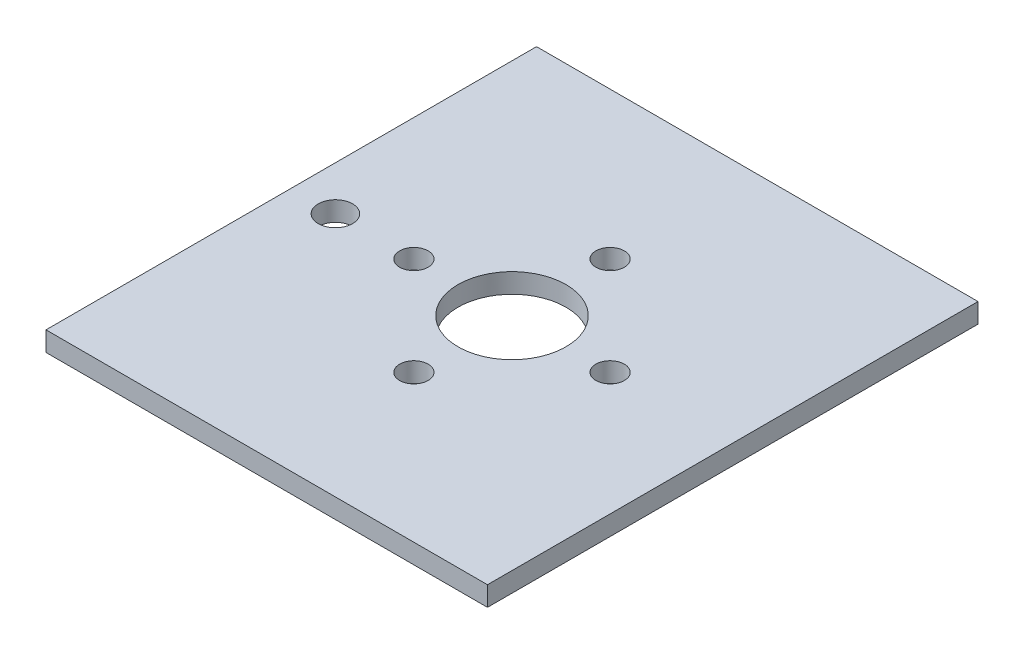
ISO-10303-21;
HEADER;
FILE_DESCRIPTION(('STEP AP214'),'2;1');
FILE_NAME('part.step','',(''),(''),'','','');
FILE_SCHEMA(('AUTOMOTIVE_DESIGN { 1 0 10303 214 1 1 1 1 }'));
ENDSEC;
DATA;
#1=APPLICATION_CONTEXT('core data for automotive mechanical design processes');
#2=APPLICATION_PROTOCOL_DEFINITION('international standard','automotive_design',2000,#1);
#3=PRODUCT_CONTEXT('',#1,'mechanical');
#4=PRODUCT('Part','Part','',(#3));
#5=PRODUCT_RELATED_PRODUCT_CATEGORY('part','',(#4));
#6=PRODUCT_DEFINITION_FORMATION('','',#4);
#7=PRODUCT_DEFINITION_CONTEXT('part definition',#1,'design');
#8=PRODUCT_DEFINITION('design','',#6,#7);
#9=PRODUCT_DEFINITION_SHAPE('','',#8);
#10=(LENGTH_UNIT() NAMED_UNIT(*) SI_UNIT(.MILLI.,.METRE.));
#11=(NAMED_UNIT(*) PLANE_ANGLE_UNIT() SI_UNIT($,.RADIAN.));
#12=(NAMED_UNIT(*) SI_UNIT($,.STERADIAN.) SOLID_ANGLE_UNIT());
#13=UNCERTAINTY_MEASURE_WITH_UNIT(LENGTH_MEASURE(1.E-05),#10,'distance_accuracy_value','');
#14=(GEOMETRIC_REPRESENTATION_CONTEXT(3) GLOBAL_UNCERTAINTY_ASSIGNED_CONTEXT((#13)) GLOBAL_UNIT_ASSIGNED_CONTEXT((#10,
#11,#12)) REPRESENTATION_CONTEXT('',''));
#15=CARTESIAN_POINT('',(0.,0.,0.));
#16=DIRECTION('',(0.,0.,1.));
#17=DIRECTION('',(1.,0.,0.));
#18=AXIS2_PLACEMENT_3D('',#15,#16,#17);
#19=CARTESIAN_POINT('',(45.,4.,50.));
#20=DIRECTION('',(-1.,0.,0.));
#21=DIRECTION('',(0.,0.,1.));
#22=AXIS2_PLACEMENT_3D('',#19,#20,#21);
#23=PLANE('',#22);
#24=DIRECTION('',(0.,0.,-1.));
#25=VECTOR('',#24,1.);
#26=CARTESIAN_POINT('',(45.,0.,50.));
#27=LINE('',#26,#25);
#28=CARTESIAN_POINT('',(45.,0.,50.));
#29=VERTEX_POINT('',#28);
#30=CARTESIAN_POINT('',(45.,0.,-50.));
#31=VERTEX_POINT('',#30);
#32=EDGE_CURVE('E103',#29,#31,#27,.T.);
#33=ORIENTED_EDGE('',*,*,#32,.T.);
#34=DIRECTION('',(0.,-1.,0.));
#35=VECTOR('',#34,1.);
#36=CARTESIAN_POINT('',(45.,4.,-50.));
#37=LINE('',#36,#35);
#38=CARTESIAN_POINT('',(45.,4.,-50.));
#39=VERTEX_POINT('',#38);
#40=EDGE_CURVE('E11',#39,#31,#37,.T.);
#41=ORIENTED_EDGE('',*,*,#40,.F.);
#42=DIRECTION('',(0.,0.,-1.));
#43=VECTOR('',#42,1.);
#44=CARTESIAN_POINT('',(45.,4.,50.));
#45=LINE('',#44,#43);
#46=CARTESIAN_POINT('',(45.,4.,50.));
#47=VERTEX_POINT('',#46);
#48=EDGE_CURVE('E90',#47,#39,#45,.T.);
#49=ORIENTED_EDGE('',*,*,#48,.F.);
#50=DIRECTION('',(0.,-1.,0.));
#51=VECTOR('',#50,1.);
#52=CARTESIAN_POINT('',(45.,4.,50.));
#53=LINE('',#52,#51);
#54=EDGE_CURVE('E99',#47,#29,#53,.T.);
#55=ORIENTED_EDGE('',*,*,#54,.T.);
#56=EDGE_LOOP('',(#33,#41,#49,#55));
#57=FACE_BOUND('',#56,.T.);
#58=ADVANCED_FACE('F37',(#57),#23,.F.);
#59=CARTESIAN_POINT('',(-45.,4.,-50.));
#60=DIRECTION('',(0.,0.,1.));
#61=DIRECTION('',(1.,0.,0.));
#62=AXIS2_PLACEMENT_3D('',#59,#60,#61);
#63=PLANE('',#62);
#64=DIRECTION('',(-1.,0.,0.));
#65=VECTOR('',#64,1.);
#66=CARTESIAN_POINT('',(-45.,0.,-50.));
#67=LINE('',#66,#65);
#68=CARTESIAN_POINT('',(-45.,0.,-50.));
#69=VERTEX_POINT('',#68);
#70=EDGE_CURVE('E94',#31,#69,#67,.T.);
#71=ORIENTED_EDGE('',*,*,#70,.T.);
#72=DIRECTION('',(0.,-1.,0.));
#73=VECTOR('',#72,1.);
#74=CARTESIAN_POINT('',(-45.,4.,-50.));
#75=LINE('',#74,#73);
#76=CARTESIAN_POINT('',(-45.,4.,-50.));
#77=VERTEX_POINT('',#76);
#78=EDGE_CURVE('E46',#77,#69,#75,.T.);
#79=ORIENTED_EDGE('',*,*,#78,.F.);
#80=DIRECTION('',(-1.,0.,0.));
#81=VECTOR('',#80,1.);
#82=CARTESIAN_POINT('',(-45.,4.,-50.));
#83=LINE('',#82,#81);
#84=EDGE_CURVE('E85',#39,#77,#83,.T.);
#85=ORIENTED_EDGE('',*,*,#84,.F.);
#86=ORIENTED_EDGE('',*,*,#40,.T.);
#87=EDGE_LOOP('',(#71,#79,#85,#86));
#88=FACE_BOUND('',#87,.T.);
#89=ADVANCED_FACE('F93',(#88),#63,.F.);
#90=CARTESIAN_POINT('',(-45.,4.,50.));
#91=DIRECTION('',(1.,0.,0.));
#92=DIRECTION('',(0.,0.,-1.));
#93=AXIS2_PLACEMENT_3D('',#90,#91,#92);
#94=PLANE('',#93);
#95=DIRECTION('',(0.,0.,1.));
#96=VECTOR('',#95,1.);
#97=CARTESIAN_POINT('',(-45.,0.,50.));
#98=LINE('',#97,#96);
#99=CARTESIAN_POINT('',(-45.,0.,50.));
#100=VERTEX_POINT('',#99);
#101=EDGE_CURVE('E72',#69,#100,#98,.T.);
#102=ORIENTED_EDGE('',*,*,#101,.T.);
#103=DIRECTION('',(0.,-1.,0.));
#104=VECTOR('',#103,1.);
#105=CARTESIAN_POINT('',(-45.,4.,50.));
#106=LINE('',#105,#104);
#107=CARTESIAN_POINT('',(-45.,4.,50.));
#108=VERTEX_POINT('',#107);
#109=EDGE_CURVE('E95',#108,#100,#106,.T.);
#110=ORIENTED_EDGE('',*,*,#109,.F.);
#111=DIRECTION('',(0.,0.,1.));
#112=VECTOR('',#111,1.);
#113=CARTESIAN_POINT('',(-45.,4.,50.));
#114=LINE('',#113,#112);
#115=EDGE_CURVE('E88',#77,#108,#114,.T.);
#116=ORIENTED_EDGE('',*,*,#115,.F.);
#117=ORIENTED_EDGE('',*,*,#78,.T.);
#118=EDGE_LOOP('',(#102,#110,#116,#117));
#119=FACE_BOUND('',#118,.T.);
#120=ADVANCED_FACE('F97',(#119),#94,.F.);
#121=CARTESIAN_POINT('',(-45.,4.,50.));
#122=DIRECTION('',(0.,0.,-1.));
#123=DIRECTION('',(-1.,0.,0.));
#124=AXIS2_PLACEMENT_3D('',#121,#122,#123);
#125=PLANE('',#124);
#126=DIRECTION('',(1.,0.,0.));
#127=VECTOR('',#126,1.);
#128=CARTESIAN_POINT('',(-45.,0.,50.));
#129=LINE('',#128,#127);
#130=EDGE_CURVE('E78',#100,#29,#129,.T.);
#131=ORIENTED_EDGE('',*,*,#130,.T.);
#132=ORIENTED_EDGE('',*,*,#54,.F.);
#133=DIRECTION('',(1.,0.,0.));
#134=VECTOR('',#133,1.);
#135=CARTESIAN_POINT('',(-45.,4.,50.));
#136=LINE('',#135,#134);
#137=EDGE_CURVE('E55',#108,#47,#136,.T.);
#138=ORIENTED_EDGE('',*,*,#137,.F.);
#139=ORIENTED_EDGE('',*,*,#109,.T.);
#140=EDGE_LOOP('',(#131,#132,#138,#139));
#141=FACE_BOUND('',#140,.T.);
#142=ADVANCED_FACE('F155',(#141),#125,.F.);
#143=CARTESIAN_POINT('',(0.,4.,0.));
#144=DIRECTION('',(0.,-1.,0.));
#145=DIRECTION('',(0.,0.,-1.));
#146=AXIS2_PLACEMENT_3D('',#143,#144,#145);
#147=PLANE('',#146);
#148=CARTESIAN_POINT('',(-36.,4.,0.));
#149=DIRECTION('',(0.,-1.,0.));
#150=DIRECTION('',(0.,0.,-1.));
#151=AXIS2_PLACEMENT_3D('',#148,#149,#150);
#152=CIRCLE('',#151,3.5);
#153=CARTESIAN_POINT('',(-36.,4.,-3.5));
#154=VERTEX_POINT('',#153);
#155=EDGE_CURVE('E40',#154,#154,#152,.T.);
#156=ORIENTED_EDGE('',*,*,#155,.T.);
#157=EDGE_LOOP('',(#156));
#158=FACE_BOUND('',#157,.T.);
#159=CARTESIAN_POINT('',(-19.9999999999998,4.,0.));
#160=DIRECTION('',(0.,-1.,0.));
#161=DIRECTION('',(0.,0.,-1.));
#162=AXIS2_PLACEMENT_3D('',#159,#160,#161);
#163=CIRCLE('',#162,2.89999999999999);
#164=CARTESIAN_POINT('',(-19.9999999999998,4.,-2.89999999999993));
#165=VERTEX_POINT('',#164);
#166=EDGE_CURVE('E126',#165,#165,#163,.T.);
#167=ORIENTED_EDGE('',*,*,#166,.T.);
#168=EDGE_LOOP('',(#167));
#169=FACE_BOUND('',#168,.T.);
#170=CARTESIAN_POINT('',(2.70852588851542E-13,4.,20.));
#171=DIRECTION('',(0.,-1.,0.));
#172=DIRECTION('',(0.,0.,-1.));
#173=AXIS2_PLACEMENT_3D('',#170,#171,#172);
#174=CIRCLE('',#173,2.89999999999999);
#175=CARTESIAN_POINT('',(2.70852588851542E-13,4.,17.1));
#176=VERTEX_POINT('',#175);
#177=EDGE_CURVE('E123',#176,#176,#174,.T.);
#178=ORIENTED_EDGE('',*,*,#177,.T.);
#179=EDGE_LOOP('',(#178));
#180=FACE_BOUND('',#179,.T.);
#181=CARTESIAN_POINT('',(20.0000000000002,4.,0.));
#182=DIRECTION('',(0.,-1.,0.));
#183=DIRECTION('',(0.,0.,-1.));
#184=AXIS2_PLACEMENT_3D('',#181,#182,#183);
#185=CIRCLE('',#184,2.89999999999999);
#186=CARTESIAN_POINT('',(20.0000000000002,4.,-2.90000000000006));
#187=VERTEX_POINT('',#186);
#188=EDGE_CURVE('E119',#187,#187,#185,.T.);
#189=ORIENTED_EDGE('',*,*,#188,.T.);
#190=EDGE_LOOP('',(#189));
#191=FACE_BOUND('',#190,.T.);
#192=CARTESIAN_POINT('',(1.31498380961862E-13,4.,-20.));
#193=DIRECTION('',(0.,-1.,0.));
#194=DIRECTION('',(0.,0.,-1.));
#195=AXIS2_PLACEMENT_3D('',#192,#193,#194);
#196=CIRCLE('',#195,2.89999999999999);
#197=CARTESIAN_POINT('',(1.31498380961862E-13,4.,-22.9));
#198=VERTEX_POINT('',#197);
#199=EDGE_CURVE('E115',#198,#198,#196,.T.);
#200=ORIENTED_EDGE('',*,*,#199,.T.);
#201=EDGE_LOOP('',(#200));
#202=FACE_BOUND('',#201,.T.);
#203=CARTESIAN_POINT('',(0.,4.,0.));
#204=DIRECTION('',(0.,1.,0.));
#205=DIRECTION('',(-1.,0.,0.));
#206=AXIS2_PLACEMENT_3D('',#203,#204,#205);
#207=CIRCLE('',#206,11.0000000000005);
#208=CARTESIAN_POINT('',(-11.0000000000005,4.,0.));
#209=VERTEX_POINT('',#208);
#210=EDGE_CURVE('E114',#209,#209,#207,.T.);
#211=ORIENTED_EDGE('',*,*,#210,.F.);
#212=EDGE_LOOP('',(#211));
#213=FACE_BOUND('',#212,.T.);
#214=ORIENTED_EDGE('',*,*,#48,.T.);
#215=ORIENTED_EDGE('',*,*,#84,.T.);
#216=ORIENTED_EDGE('',*,*,#115,.T.);
#217=ORIENTED_EDGE('',*,*,#137,.T.);
#218=EDGE_LOOP('',(#214,#215,#216,#217));
#219=FACE_BOUND('',#218,.T.);
#220=ADVANCED_FACE('F86',(#158,#169,#180,#191,#202,#213,#219),#147,.F.);
#221=CARTESIAN_POINT('',(0.,0.,0.));
#222=DIRECTION('',(0.,-1.,0.));
#223=DIRECTION('',(0.,0.,-1.));
#224=AXIS2_PLACEMENT_3D('',#221,#222,#223);
#225=PLANE('',#224);
#226=CARTESIAN_POINT('',(-36.,0.,0.));
#227=DIRECTION('',(0.,-1.,0.));
#228=DIRECTION('',(0.,0.,-1.));
#229=AXIS2_PLACEMENT_3D('',#226,#227,#228);
#230=CIRCLE('',#229,3.5);
#231=CARTESIAN_POINT('',(-36.,0.,-3.5));
#232=VERTEX_POINT('',#231);
#233=EDGE_CURVE('E134',#232,#232,#230,.T.);
#234=ORIENTED_EDGE('',*,*,#233,.F.);
#235=EDGE_LOOP('',(#234));
#236=FACE_BOUND('',#235,.T.);
#237=CARTESIAN_POINT('',(-19.9999999999998,0.,0.));
#238=DIRECTION('',(0.,-1.,0.));
#239=DIRECTION('',(0.,0.,-1.));
#240=AXIS2_PLACEMENT_3D('',#237,#238,#239);
#241=CIRCLE('',#240,2.89999999999999);
#242=CARTESIAN_POINT('',(-19.9999999999998,0.,-2.89999999999993));
#243=VERTEX_POINT('',#242);
#244=EDGE_CURVE('E127',#243,#243,#241,.T.);
#245=ORIENTED_EDGE('',*,*,#244,.F.);
#246=EDGE_LOOP('',(#245));
#247=FACE_BOUND('',#246,.T.);
#248=CARTESIAN_POINT('',(2.70852588851542E-13,0.,20.));
#249=DIRECTION('',(0.,-1.,0.));
#250=DIRECTION('',(0.,0.,-1.));
#251=AXIS2_PLACEMENT_3D('',#248,#249,#250);
#252=CIRCLE('',#251,2.89999999999999);
#253=CARTESIAN_POINT('',(2.70852588851542E-13,0.,17.1));
#254=VERTEX_POINT('',#253);
#255=EDGE_CURVE('E124',#254,#254,#252,.T.);
#256=ORIENTED_EDGE('',*,*,#255,.F.);
#257=EDGE_LOOP('',(#256));
#258=FACE_BOUND('',#257,.T.);
#259=CARTESIAN_POINT('',(20.0000000000002,0.,0.));
#260=DIRECTION('',(0.,-1.,0.));
#261=DIRECTION('',(0.,0.,-1.));
#262=AXIS2_PLACEMENT_3D('',#259,#260,#261);
#263=CIRCLE('',#262,2.89999999999999);
#264=CARTESIAN_POINT('',(20.0000000000002,0.,-2.90000000000006));
#265=VERTEX_POINT('',#264);
#266=EDGE_CURVE('E120',#265,#265,#263,.T.);
#267=ORIENTED_EDGE('',*,*,#266,.F.);
#268=EDGE_LOOP('',(#267));
#269=FACE_BOUND('',#268,.T.);
#270=CARTESIAN_POINT('',(1.31498380961862E-13,0.,-20.));
#271=DIRECTION('',(0.,-1.,0.));
#272=DIRECTION('',(0.,0.,-1.));
#273=AXIS2_PLACEMENT_3D('',#270,#271,#272);
#274=CIRCLE('',#273,2.89999999999999);
#275=CARTESIAN_POINT('',(1.31498380961862E-13,0.,-22.9));
#276=VERTEX_POINT('',#275);
#277=EDGE_CURVE('E118',#276,#276,#274,.T.);
#278=ORIENTED_EDGE('',*,*,#277,.F.);
#279=EDGE_LOOP('',(#278));
#280=FACE_BOUND('',#279,.T.);
#281=CARTESIAN_POINT('',(0.,0.,0.));
#282=DIRECTION('',(0.,-1.,0.));
#283=DIRECTION('',(0.,0.,-1.));
#284=AXIS2_PLACEMENT_3D('',#281,#282,#283);
#285=CIRCLE('',#284,11.0000000000005);
#286=CARTESIAN_POINT('',(0.,0.,-11.0000000000005));
#287=VERTEX_POINT('',#286);
#288=EDGE_CURVE('E106',#287,#287,#285,.F.);
#289=ORIENTED_EDGE('',*,*,#288,.T.);
#290=EDGE_LOOP('',(#289));
#291=FACE_BOUND('',#290,.T.);
#292=ORIENTED_EDGE('',*,*,#32,.F.);
#293=ORIENTED_EDGE('',*,*,#130,.F.);
#294=ORIENTED_EDGE('',*,*,#101,.F.);
#295=ORIENTED_EDGE('',*,*,#70,.F.);
#296=EDGE_LOOP('',(#292,#293,#294,#295));
#297=FACE_BOUND('',#296,.T.);
#298=ADVANCED_FACE('F154',(#236,#247,#258,#269,#280,#291,#297),#225,.T.);
#299=CARTESIAN_POINT('',(0.,0.,0.));
#300=DIRECTION('',(0.,-1.,0.));
#301=DIRECTION('',(1.,0.,0.));
#302=AXIS2_PLACEMENT_3D('',#299,#300,#301);
#303=CYLINDRICAL_SURFACE('',#302,11.0000000000005);
#304=ORIENTED_EDGE('',*,*,#288,.F.);
#305=EDGE_LOOP('',(#304));
#306=FACE_BOUND('',#305,.T.);
#307=ORIENTED_EDGE('',*,*,#210,.T.);
#308=EDGE_LOOP('',(#307));
#309=FACE_BOUND('',#308,.T.);
#310=ADVANCED_FACE('F151',(#306,#309),#303,.F.);
#311=CARTESIAN_POINT('',(1.31498380961862E-13,-8.,-20.));
#312=DIRECTION('',(0.,-1.,0.));
#313=DIRECTION('',(0.,0.,-1.));
#314=AXIS2_PLACEMENT_3D('',#311,#312,#313);
#315=CYLINDRICAL_SURFACE('',#314,2.89999999999999);
#316=ORIENTED_EDGE('',*,*,#277,.T.);
#317=EDGE_LOOP('',(#316));
#318=FACE_BOUND('',#317,.T.);
#319=ORIENTED_EDGE('',*,*,#199,.F.);
#320=EDGE_LOOP('',(#319));
#321=FACE_BOUND('',#320,.T.);
#322=ADVANCED_FACE('F194',(#318,#321),#315,.F.);
#323=CARTESIAN_POINT('',(20.0000000000002,-8.,0.));
#324=DIRECTION('',(0.,-1.,0.));
#325=DIRECTION('',(0.,0.,-1.));
#326=AXIS2_PLACEMENT_3D('',#323,#324,#325);
#327=CYLINDRICAL_SURFACE('',#326,2.89999999999999);
#328=ORIENTED_EDGE('',*,*,#266,.T.);
#329=EDGE_LOOP('',(#328));
#330=FACE_BOUND('',#329,.T.);
#331=ORIENTED_EDGE('',*,*,#188,.F.);
#332=EDGE_LOOP('',(#331));
#333=FACE_BOUND('',#332,.T.);
#334=ADVANCED_FACE('F205',(#330,#333),#327,.F.);
#335=CARTESIAN_POINT('',(2.70852588851542E-13,-8.,20.));
#336=DIRECTION('',(0.,-1.,0.));
#337=DIRECTION('',(0.,0.,-1.));
#338=AXIS2_PLACEMENT_3D('',#335,#336,#337);
#339=CYLINDRICAL_SURFACE('',#338,2.89999999999999);
#340=ORIENTED_EDGE('',*,*,#255,.T.);
#341=EDGE_LOOP('',(#340));
#342=FACE_BOUND('',#341,.T.);
#343=ORIENTED_EDGE('',*,*,#177,.F.);
#344=EDGE_LOOP('',(#343));
#345=FACE_BOUND('',#344,.T.);
#346=ADVANCED_FACE('F216',(#342,#345),#339,.F.);
#347=CARTESIAN_POINT('',(-19.9999999999998,-8.,0.));
#348=DIRECTION('',(0.,-1.,0.));
#349=DIRECTION('',(0.,0.,-1.));
#350=AXIS2_PLACEMENT_3D('',#347,#348,#349);
#351=CYLINDRICAL_SURFACE('',#350,2.89999999999999);
#352=ORIENTED_EDGE('',*,*,#244,.T.);
#353=EDGE_LOOP('',(#352));
#354=FACE_BOUND('',#353,.T.);
#355=ORIENTED_EDGE('',*,*,#166,.F.);
#356=EDGE_LOOP('',(#355));
#357=FACE_BOUND('',#356,.T.);
#358=ADVANCED_FACE('F227',(#354,#357),#351,.F.);
#359=CARTESIAN_POINT('',(-36.,0.,0.));
#360=DIRECTION('',(0.,-1.,0.));
#361=DIRECTION('',(0.,0.,-1.));
#362=AXIS2_PLACEMENT_3D('',#359,#360,#361);
#363=CYLINDRICAL_SURFACE('',#362,3.5);
#364=ORIENTED_EDGE('',*,*,#233,.T.);
#365=EDGE_LOOP('',(#364));
#366=FACE_BOUND('',#365,.T.);
#367=ORIENTED_EDGE('',*,*,#155,.F.);
#368=EDGE_LOOP('',(#367));
#369=FACE_BOUND('',#368,.T.);
#370=ADVANCED_FACE('F237',(#366,#369),#363,.F.);
#371=CLOSED_SHELL('',(#58,#89,#120,#142,#220,#298,#310,#322,#334,#346,#358,#370));
#372=MANIFOLD_SOLID_BREP('B2',#371);
#373=ADVANCED_BREP_SHAPE_REPRESENTATION('',(#18,#372),#14);
#374=SHAPE_DEFINITION_REPRESENTATION(#9,#373);
ENDSEC;
END-ISO-10303-21;
